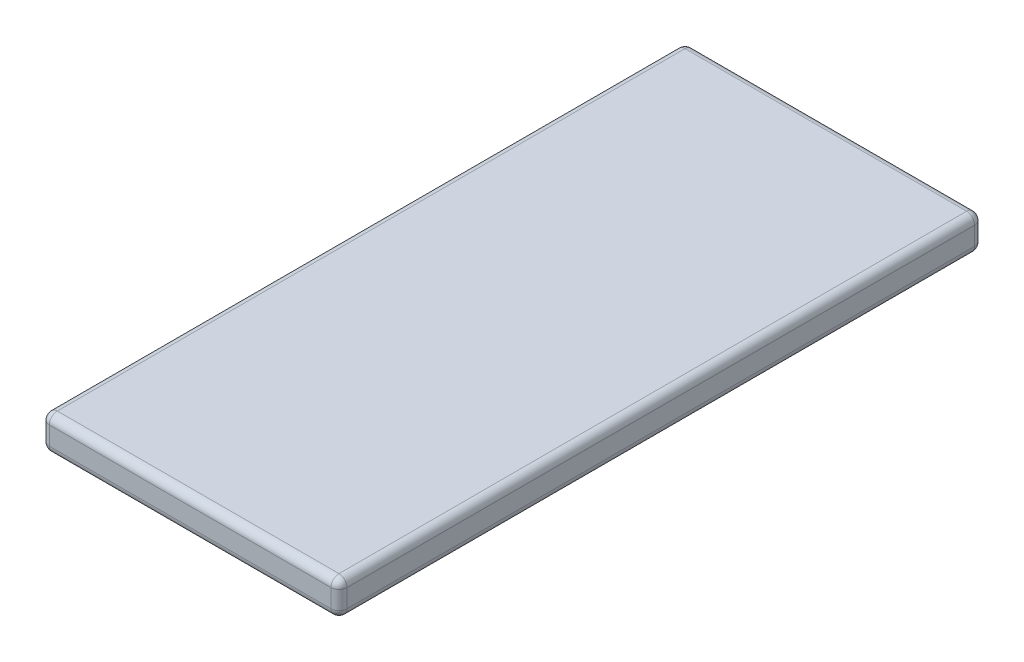
ISO-10303-21;
HEADER;
FILE_DESCRIPTION(('STEP AP214'),'2;1');
FILE_NAME('part.step','',(''),(''),'','','');
FILE_SCHEMA(('AUTOMOTIVE_DESIGN { 1 0 10303 214 1 1 1 1 }'));
ENDSEC;
DATA;
#1=APPLICATION_CONTEXT('core data for automotive mechanical design processes');
#2=APPLICATION_PROTOCOL_DEFINITION('international standard','automotive_design',2000,#1);
#3=PRODUCT_CONTEXT('',#1,'mechanical');
#4=PRODUCT('Part','Part','',(#3));
#5=PRODUCT_RELATED_PRODUCT_CATEGORY('part','',(#4));
#6=PRODUCT_DEFINITION_FORMATION('','',#4);
#7=PRODUCT_DEFINITION_CONTEXT('part definition',#1,'design');
#8=PRODUCT_DEFINITION('design','',#6,#7);
#9=PRODUCT_DEFINITION_SHAPE('','',#8);
#10=(LENGTH_UNIT() NAMED_UNIT(*) SI_UNIT(.MILLI.,.METRE.));
#11=(NAMED_UNIT(*) PLANE_ANGLE_UNIT() SI_UNIT($,.RADIAN.));
#12=(NAMED_UNIT(*) SI_UNIT($,.STERADIAN.) SOLID_ANGLE_UNIT());
#13=UNCERTAINTY_MEASURE_WITH_UNIT(LENGTH_MEASURE(1.E-05),#10,'distance_accuracy_value','');
#14=(GEOMETRIC_REPRESENTATION_CONTEXT(3) GLOBAL_UNCERTAINTY_ASSIGNED_CONTEXT((#13)) GLOBAL_UNIT_ASSIGNED_CONTEXT((#10,
#11,#12)) REPRESENTATION_CONTEXT('',''));
#15=CARTESIAN_POINT('',(0.,0.,0.));
#16=DIRECTION('',(0.,0.,1.));
#17=DIRECTION('',(1.,0.,0.));
#18=AXIS2_PLACEMENT_3D('',#15,#16,#17);
#19=CARTESIAN_POINT('',(37.,8.56,-80.));
#20=DIRECTION('',(-1.,0.,0.));
#21=DIRECTION('',(0.,0.,1.));
#22=AXIS2_PLACEMENT_3D('',#19,#20,#21);
#23=PLANE('',#22);
#24=DIRECTION('',(0.,0.,-1.));
#25=VECTOR('',#24,1.);
#26=CARTESIAN_POINT('',(37.,6.56,80.));
#27=LINE('',#26,#25);
#28=CARTESIAN_POINT('',(37.,6.56,-78.));
#29=VERTEX_POINT('',#28);
#30=CARTESIAN_POINT('',(37.,6.56,78.));
#31=VERTEX_POINT('',#30);
#32=EDGE_CURVE('E190',#29,#31,#27,.F.);
#33=ORIENTED_EDGE('',*,*,#32,.T.);
#34=DIRECTION('',(0.,-1.,0.));
#35=VECTOR('',#34,1.);
#36=CARTESIAN_POINT('',(37.,8.56,78.));
#37=LINE('',#36,#35);
#38=CARTESIAN_POINT('',(37.,2.,78.));
#39=VERTEX_POINT('',#38);
#40=EDGE_CURVE('E195',#31,#39,#37,.T.);
#41=ORIENTED_EDGE('',*,*,#40,.T.);
#42=DIRECTION('',(0.,0.,-1.));
#43=VECTOR('',#42,1.);
#44=CARTESIAN_POINT('',(37.,2.,-80.));
#45=LINE('',#44,#43);
#46=CARTESIAN_POINT('',(37.,2.,-78.));
#47=VERTEX_POINT('',#46);
#48=EDGE_CURVE('E192',#39,#47,#45,.T.);
#49=ORIENTED_EDGE('',*,*,#48,.T.);
#50=DIRECTION('',(0.,-1.,0.));
#51=VECTOR('',#50,1.);
#52=CARTESIAN_POINT('',(37.,8.56,-78.));
#53=LINE('',#52,#51);
#54=EDGE_CURVE('E188',#47,#29,#53,.F.);
#55=ORIENTED_EDGE('',*,*,#54,.T.);
#56=EDGE_LOOP('',(#33,#41,#49,#55));
#57=FACE_BOUND('',#56,.T.);
#58=ADVANCED_FACE('F36',(#57),#23,.F.);
#59=CARTESIAN_POINT('',(-37.,8.56,-80.));
#60=DIRECTION('',(0.,0.,1.));
#61=DIRECTION('',(1.,0.,0.));
#62=AXIS2_PLACEMENT_3D('',#59,#60,#61);
#63=PLANE('',#62);
#64=DIRECTION('',(-1.,0.,0.));
#65=VECTOR('',#64,1.);
#66=CARTESIAN_POINT('',(37.,6.56,-80.));
#67=LINE('',#66,#65);
#68=CARTESIAN_POINT('',(-35.,6.56,-80.));
#69=VERTEX_POINT('',#68);
#70=CARTESIAN_POINT('',(35.,6.56,-80.));
#71=VERTEX_POINT('',#70);
#72=EDGE_CURVE('E153',#69,#71,#67,.F.);
#73=ORIENTED_EDGE('',*,*,#72,.T.);
#74=DIRECTION('',(0.,-1.,0.));
#75=VECTOR('',#74,1.);
#76=CARTESIAN_POINT('',(35.,8.56,-80.));
#77=LINE('',#76,#75);
#78=CARTESIAN_POINT('',(35.,2.,-80.));
#79=VERTEX_POINT('',#78);
#80=EDGE_CURVE('E157',#71,#79,#77,.T.);
#81=ORIENTED_EDGE('',*,*,#80,.T.);
#82=DIRECTION('',(-1.,0.,0.));
#83=VECTOR('',#82,1.);
#84=CARTESIAN_POINT('',(-37.,2.,-80.));
#85=LINE('',#84,#83);
#86=CARTESIAN_POINT('',(-35.,2.,-80.));
#87=VERTEX_POINT('',#86);
#88=EDGE_CURVE('E129',#79,#87,#85,.T.);
#89=ORIENTED_EDGE('',*,*,#88,.T.);
#90=DIRECTION('',(0.,-1.,0.));
#91=VECTOR('',#90,1.);
#92=CARTESIAN_POINT('',(-35.,8.56,-80.));
#93=LINE('',#92,#91);
#94=EDGE_CURVE('E147',#87,#69,#93,.F.);
#95=ORIENTED_EDGE('',*,*,#94,.T.);
#96=EDGE_LOOP('',(#73,#81,#89,#95));
#97=FACE_BOUND('',#96,.T.);
#98=ADVANCED_FACE('F155',(#97),#63,.F.);
#99=CARTESIAN_POINT('',(-37.,8.56,-80.));
#100=DIRECTION('',(1.,0.,0.));
#101=DIRECTION('',(0.,0.,-1.));
#102=AXIS2_PLACEMENT_3D('',#99,#100,#101);
#103=PLANE('',#102);
#104=DIRECTION('',(0.,0.,1.));
#105=VECTOR('',#104,1.);
#106=CARTESIAN_POINT('',(-37.,2.,-80.));
#107=LINE('',#106,#105);
#108=CARTESIAN_POINT('',(-37.,2.,-78.));
#109=VERTEX_POINT('',#108);
#110=CARTESIAN_POINT('',(-37.,2.,78.));
#111=VERTEX_POINT('',#110);
#112=EDGE_CURVE('E174',#109,#111,#107,.T.);
#113=ORIENTED_EDGE('',*,*,#112,.T.);
#114=DIRECTION('',(0.,-1.,0.));
#115=VECTOR('',#114,1.);
#116=CARTESIAN_POINT('',(-37.,8.56,78.));
#117=LINE('',#116,#115);
#118=CARTESIAN_POINT('',(-37.,6.56,78.));
#119=VERTEX_POINT('',#118);
#120=EDGE_CURVE('E177',#111,#119,#117,.F.);
#121=ORIENTED_EDGE('',*,*,#120,.T.);
#122=DIRECTION('',(0.,0.,1.));
#123=VECTOR('',#122,1.);
#124=CARTESIAN_POINT('',(-37.,6.56,-80.));
#125=LINE('',#124,#123);
#126=CARTESIAN_POINT('',(-37.,6.56,-78.));
#127=VERTEX_POINT('',#126);
#128=EDGE_CURVE('E172',#119,#127,#125,.F.);
#129=ORIENTED_EDGE('',*,*,#128,.T.);
#130=DIRECTION('',(0.,-1.,0.));
#131=VECTOR('',#130,1.);
#132=CARTESIAN_POINT('',(-37.,8.56,-78.));
#133=LINE('',#132,#131);
#134=EDGE_CURVE('E170',#127,#109,#133,.T.);
#135=ORIENTED_EDGE('',*,*,#134,.T.);
#136=EDGE_LOOP('',(#113,#121,#129,#135));
#137=FACE_BOUND('',#136,.T.);
#138=ADVANCED_FACE('F330',(#137),#103,.F.);
#139=CARTESIAN_POINT('',(-37.,8.56,80.));
#140=DIRECTION('',(0.,0.,-1.));
#141=DIRECTION('',(-1.,0.,0.));
#142=AXIS2_PLACEMENT_3D('',#139,#140,#141);
#143=PLANE('',#142);
#144=DIRECTION('',(1.,0.,0.));
#145=VECTOR('',#144,1.);
#146=CARTESIAN_POINT('',(-37.,6.56,80.));
#147=LINE('',#146,#145);
#148=CARTESIAN_POINT('',(35.,6.56,80.));
#149=VERTEX_POINT('',#148);
#150=CARTESIAN_POINT('',(-35.,6.56,80.));
#151=VERTEX_POINT('',#150);
#152=EDGE_CURVE('E181',#149,#151,#147,.F.);
#153=ORIENTED_EDGE('',*,*,#152,.T.);
#154=DIRECTION('',(0.,-1.,0.));
#155=VECTOR('',#154,1.);
#156=CARTESIAN_POINT('',(-35.,8.56,80.));
#157=LINE('',#156,#155);
#158=CARTESIAN_POINT('',(-35.,2.,80.));
#159=VERTEX_POINT('',#158);
#160=EDGE_CURVE('E186',#151,#159,#157,.T.);
#161=ORIENTED_EDGE('',*,*,#160,.T.);
#162=DIRECTION('',(1.,0.,0.));
#163=VECTOR('',#162,1.);
#164=CARTESIAN_POINT('',(-37.,2.,80.));
#165=LINE('',#164,#163);
#166=CARTESIAN_POINT('',(35.,2.,80.));
#167=VERTEX_POINT('',#166);
#168=EDGE_CURVE('E183',#159,#167,#165,.T.);
#169=ORIENTED_EDGE('',*,*,#168,.T.);
#170=DIRECTION('',(0.,-1.,0.));
#171=VECTOR('',#170,1.);
#172=CARTESIAN_POINT('',(35.,8.56,80.));
#173=LINE('',#172,#171);
#174=EDGE_CURVE('E179',#167,#149,#173,.F.);
#175=ORIENTED_EDGE('',*,*,#174,.T.);
#176=EDGE_LOOP('',(#153,#161,#169,#175));
#177=FACE_BOUND('',#176,.T.);
#178=ADVANCED_FACE('F297',(#177),#143,.F.);
#179=CARTESIAN_POINT('',(0.,8.56,0.));
#180=DIRECTION('',(0.,1.,0.));
#181=DIRECTION('',(0.,0.,1.));
#182=AXIS2_PLACEMENT_3D('',#179,#180,#181);
#183=PLANE('',#182);
#184=DIRECTION('',(0.,0.,1.));
#185=VECTOR('',#184,1.);
#186=CARTESIAN_POINT('',(-35.,8.56,80.));
#187=LINE('',#186,#185);
#188=CARTESIAN_POINT('',(-35.,8.56,-78.));
#189=VERTEX_POINT('',#188);
#190=CARTESIAN_POINT('',(-35.,8.56,78.));
#191=VERTEX_POINT('',#190);
#192=EDGE_CURVE('E45',#189,#191,#187,.T.);
#193=ORIENTED_EDGE('',*,*,#192,.T.);
#194=DIRECTION('',(1.,0.,0.));
#195=VECTOR('',#194,1.);
#196=CARTESIAN_POINT('',(37.,8.56,78.));
#197=LINE('',#196,#195);
#198=CARTESIAN_POINT('',(35.,8.56,78.));
#199=VERTEX_POINT('',#198);
#200=EDGE_CURVE('E11',#191,#199,#197,.T.);
#201=ORIENTED_EDGE('',*,*,#200,.T.);
#202=DIRECTION('',(0.,0.,-1.));
#203=VECTOR('',#202,1.);
#204=CARTESIAN_POINT('',(35.,8.56,-80.));
#205=LINE('',#204,#203);
#206=CARTESIAN_POINT('',(35.,8.56,-78.));
#207=VERTEX_POINT('',#206);
#208=EDGE_CURVE('E197',#199,#207,#205,.T.);
#209=ORIENTED_EDGE('',*,*,#208,.T.);
#210=DIRECTION('',(-1.,0.,0.));
#211=VECTOR('',#210,1.);
#212=CARTESIAN_POINT('',(-37.,8.56,-78.));
#213=LINE('',#212,#211);
#214=EDGE_CURVE('E56',#207,#189,#213,.T.);
#215=ORIENTED_EDGE('',*,*,#214,.T.);
#216=EDGE_LOOP('',(#193,#201,#209,#215));
#217=FACE_BOUND('',#216,.T.);
#218=ADVANCED_FACE('F277',(#217),#183,.T.);
#219=CARTESIAN_POINT('',(0.,0.,0.));
#220=DIRECTION('',(0.,1.,0.));
#221=DIRECTION('',(0.,0.,1.));
#222=AXIS2_PLACEMENT_3D('',#219,#220,#221);
#223=PLANE('',#222);
#224=DIRECTION('',(0.,0.,1.));
#225=VECTOR('',#224,1.);
#226=CARTESIAN_POINT('',(-35.,0.,0.));
#227=LINE('',#226,#225);
#228=CARTESIAN_POINT('',(-35.,0.,78.));
#229=VERTEX_POINT('',#228);
#230=CARTESIAN_POINT('',(-35.,0.,-78.));
#231=VERTEX_POINT('',#230);
#232=EDGE_CURVE('E167',#229,#231,#227,.F.);
#233=ORIENTED_EDGE('',*,*,#232,.T.);
#234=DIRECTION('',(-1.,0.,0.));
#235=VECTOR('',#234,1.);
#236=CARTESIAN_POINT('',(0.,0.,-78.));
#237=LINE('',#236,#235);
#238=CARTESIAN_POINT('',(35.,0.,-78.));
#239=VERTEX_POINT('',#238);
#240=EDGE_CURVE('E131',#231,#239,#237,.F.);
#241=ORIENTED_EDGE('',*,*,#240,.T.);
#242=DIRECTION('',(0.,0.,-1.));
#243=VECTOR('',#242,1.);
#244=CARTESIAN_POINT('',(35.,0.,0.));
#245=LINE('',#244,#243);
#246=CARTESIAN_POINT('',(35.,0.,78.));
#247=VERTEX_POINT('',#246);
#248=EDGE_CURVE('E160',#239,#247,#245,.F.);
#249=ORIENTED_EDGE('',*,*,#248,.T.);
#250=DIRECTION('',(1.,0.,0.));
#251=VECTOR('',#250,1.);
#252=CARTESIAN_POINT('',(0.,0.,78.));
#253=LINE('',#252,#251);
#254=EDGE_CURVE('E165',#247,#229,#253,.F.);
#255=ORIENTED_EDGE('',*,*,#254,.T.);
#256=EDGE_LOOP('',(#233,#241,#249,#255));
#257=FACE_BOUND('',#256,.T.);
#258=ADVANCED_FACE('F358',(#257),#223,.F.);
#259=CARTESIAN_POINT('',(0.,6.56,78.));
#260=DIRECTION('',(-1.,0.,0.));
#261=DIRECTION('',(0.,0.,1.));
#262=AXIS2_PLACEMENT_3D('',#259,#260,#261);
#263=CYLINDRICAL_SURFACE('',#262,2.);
#264=CARTESIAN_POINT('',(35.,6.56,78.));
#265=DIRECTION('',(1.,0.,0.));
#266=DIRECTION('',(0.,0.,-1.));
#267=AXIS2_PLACEMENT_3D('',#264,#265,#266);
#268=CIRCLE('',#267,2.);
#269=EDGE_CURVE('E40',#199,#149,#268,.T.);
#270=ORIENTED_EDGE('',*,*,#269,.F.);
#271=ORIENTED_EDGE('',*,*,#200,.F.);
#272=CARTESIAN_POINT('',(-35.,6.56,78.));
#273=DIRECTION('',(-1.,0.,0.));
#274=DIRECTION('',(0.,0.,1.));
#275=AXIS2_PLACEMENT_3D('',#272,#273,#274);
#276=CIRCLE('',#275,2.);
#277=EDGE_CURVE('E250',#151,#191,#276,.T.);
#278=ORIENTED_EDGE('',*,*,#277,.F.);
#279=ORIENTED_EDGE('',*,*,#152,.F.);
#280=EDGE_LOOP('',(#270,#271,#278,#279));
#281=FACE_BOUND('',#280,.T.);
#282=ADVANCED_FACE('F38',(#281),#263,.T.);
#283=CARTESIAN_POINT('',(35.,6.56,78.));
#284=DIRECTION('',(0.,0.,1.));
#285=DIRECTION('',(1.,0.,0.));
#286=AXIS2_PLACEMENT_3D('',#283,#284,#285);
#287=SPHERICAL_SURFACE('',#286,2.);
#288=CARTESIAN_POINT('',(35.,6.56,78.));
#289=DIRECTION('',(0.,0.,1.));
#290=DIRECTION('',(1.,0.,0.));
#291=AXIS2_PLACEMENT_3D('',#288,#289,#290);
#292=CIRCLE('',#291,2.);
#293=EDGE_CURVE('E245',#199,#31,#292,.F.);
#294=ORIENTED_EDGE('',*,*,#293,.F.);
#295=ORIENTED_EDGE('',*,*,#269,.T.);
#296=CARTESIAN_POINT('',(35.,6.56,78.));
#297=DIRECTION('',(0.,1.,0.));
#298=DIRECTION('',(0.,0.,1.));
#299=AXIS2_PLACEMENT_3D('',#296,#297,#298);
#300=CIRCLE('',#299,2.);
#301=EDGE_CURVE('E248',#31,#149,#300,.F.);
#302=ORIENTED_EDGE('',*,*,#301,.F.);
#303=EDGE_LOOP('',(#294,#295,#302));
#304=FACE_BOUND('',#303,.T.);
#305=ADVANCED_FACE('F261',(#304),#287,.T.);
#306=CARTESIAN_POINT('',(-35.,6.56,78.));
#307=DIRECTION('',(0.,1.,0.));
#308=DIRECTION('',(0.,0.,1.));
#309=AXIS2_PLACEMENT_3D('',#306,#307,#308);
#310=SPHERICAL_SURFACE('',#309,2.);
#311=CARTESIAN_POINT('',(-35.,6.56,78.));
#312=DIRECTION('',(0.,1.,0.));
#313=DIRECTION('',(0.,0.,1.));
#314=AXIS2_PLACEMENT_3D('',#311,#312,#313);
#315=CIRCLE('',#314,2.);
#316=EDGE_CURVE('E239',#151,#119,#315,.F.);
#317=ORIENTED_EDGE('',*,*,#316,.F.);
#318=ORIENTED_EDGE('',*,*,#277,.T.);
#319=CARTESIAN_POINT('',(-35.,6.56,78.));
#320=DIRECTION('',(0.,0.,1.));
#321=DIRECTION('',(1.,0.,0.));
#322=AXIS2_PLACEMENT_3D('',#319,#320,#321);
#323=CIRCLE('',#322,2.);
#324=EDGE_CURVE('E242',#119,#191,#323,.F.);
#325=ORIENTED_EDGE('',*,*,#324,.F.);
#326=EDGE_LOOP('',(#317,#318,#325));
#327=FACE_BOUND('',#326,.T.);
#328=ADVANCED_FACE('F289',(#327),#310,.T.);
#329=CARTESIAN_POINT('',(35.,8.56,78.));
#330=DIRECTION('',(0.,-1.,0.));
#331=DIRECTION('',(0.,0.,-1.));
#332=AXIS2_PLACEMENT_3D('',#329,#330,#331);
#333=CYLINDRICAL_SURFACE('',#332,2.);
#334=ORIENTED_EDGE('',*,*,#301,.T.);
#335=ORIENTED_EDGE('',*,*,#174,.F.);
#336=CARTESIAN_POINT('',(35.,2.,78.));
#337=DIRECTION('',(0.,-1.,0.));
#338=DIRECTION('',(0.,0.,-1.));
#339=AXIS2_PLACEMENT_3D('',#336,#337,#338);
#340=CIRCLE('',#339,2.);
#341=EDGE_CURVE('E234',#39,#167,#340,.T.);
#342=ORIENTED_EDGE('',*,*,#341,.F.);
#343=ORIENTED_EDGE('',*,*,#40,.F.);
#344=EDGE_LOOP('',(#334,#335,#342,#343));
#345=FACE_BOUND('',#344,.T.);
#346=ADVANCED_FACE('F267',(#345),#333,.T.);
#347=CARTESIAN_POINT('',(35.,6.56,0.));
#348=DIRECTION('',(0.,0.,1.));
#349=DIRECTION('',(1.,0.,0.));
#350=AXIS2_PLACEMENT_3D('',#347,#348,#349);
#351=CYLINDRICAL_SURFACE('',#350,2.);
#352=ORIENTED_EDGE('',*,*,#293,.T.);
#353=ORIENTED_EDGE('',*,*,#32,.F.);
#354=CARTESIAN_POINT('',(35.,6.56,-78.));
#355=DIRECTION('',(0.,0.,-1.));
#356=DIRECTION('',(-1.,0.,0.));
#357=AXIS2_PLACEMENT_3D('',#354,#355,#356);
#358=CIRCLE('',#357,2.);
#359=EDGE_CURVE('E231',#207,#29,#358,.T.);
#360=ORIENTED_EDGE('',*,*,#359,.F.);
#361=ORIENTED_EDGE('',*,*,#208,.F.);
#362=EDGE_LOOP('',(#352,#353,#360,#361));
#363=FACE_BOUND('',#362,.T.);
#364=ADVANCED_FACE('F276',(#363),#351,.T.);
#365=CARTESIAN_POINT('',(0.,6.56,-78.));
#366=DIRECTION('',(1.,0.,0.));
#367=DIRECTION('',(0.,0.,-1.));
#368=AXIS2_PLACEMENT_3D('',#365,#366,#367);
#369=CYLINDRICAL_SURFACE('',#368,2.);
#370=CARTESIAN_POINT('',(-35.,6.56,-78.));
#371=DIRECTION('',(-1.,0.,0.));
#372=DIRECTION('',(0.,0.,1.));
#373=AXIS2_PLACEMENT_3D('',#370,#371,#372);
#374=CIRCLE('',#373,2.);
#375=EDGE_CURVE('E225',#189,#69,#374,.T.);
#376=ORIENTED_EDGE('',*,*,#375,.F.);
#377=ORIENTED_EDGE('',*,*,#214,.F.);
#378=CARTESIAN_POINT('',(35.,6.56,-78.));
#379=DIRECTION('',(1.,0.,0.));
#380=DIRECTION('',(0.,0.,-1.));
#381=AXIS2_PLACEMENT_3D('',#378,#379,#380);
#382=CIRCLE('',#381,2.);
#383=EDGE_CURVE('E228',#71,#207,#382,.T.);
#384=ORIENTED_EDGE('',*,*,#383,.F.);
#385=ORIENTED_EDGE('',*,*,#72,.F.);
#386=EDGE_LOOP('',(#376,#377,#384,#385));
#387=FACE_BOUND('',#386,.T.);
#388=ADVANCED_FACE('F281',(#387),#369,.T.);
#389=CARTESIAN_POINT('',(-35.,6.56,0.));
#390=DIRECTION('',(0.,0.,-1.));
#391=DIRECTION('',(-1.,0.,0.));
#392=AXIS2_PLACEMENT_3D('',#389,#390,#391);
#393=CYLINDRICAL_SURFACE('',#392,2.);
#394=ORIENTED_EDGE('',*,*,#324,.T.);
#395=ORIENTED_EDGE('',*,*,#192,.F.);
#396=CARTESIAN_POINT('',(-35.,6.56,-78.));
#397=DIRECTION('',(0.,0.,-1.));
#398=DIRECTION('',(-1.,0.,0.));
#399=AXIS2_PLACEMENT_3D('',#396,#397,#398);
#400=CIRCLE('',#399,2.);
#401=EDGE_CURVE('E222',#127,#189,#400,.T.);
#402=ORIENTED_EDGE('',*,*,#401,.F.);
#403=ORIENTED_EDGE('',*,*,#128,.F.);
#404=EDGE_LOOP('',(#394,#395,#402,#403));
#405=FACE_BOUND('',#404,.T.);
#406=ADVANCED_FACE('F288',(#405),#393,.T.);
#407=CARTESIAN_POINT('',(-35.,8.56,78.));
#408=DIRECTION('',(0.,-1.,0.));
#409=DIRECTION('',(0.,0.,-1.));
#410=AXIS2_PLACEMENT_3D('',#407,#408,#409);
#411=CYLINDRICAL_SURFACE('',#410,2.);
#412=ORIENTED_EDGE('',*,*,#316,.T.);
#413=ORIENTED_EDGE('',*,*,#120,.F.);
#414=CARTESIAN_POINT('',(-35.,2.,78.));
#415=DIRECTION('',(0.,-1.,0.));
#416=DIRECTION('',(0.,0.,-1.));
#417=AXIS2_PLACEMENT_3D('',#414,#415,#416);
#418=CIRCLE('',#417,2.);
#419=EDGE_CURVE('E219',#159,#111,#418,.T.);
#420=ORIENTED_EDGE('',*,*,#419,.F.);
#421=ORIENTED_EDGE('',*,*,#160,.F.);
#422=EDGE_LOOP('',(#412,#413,#420,#421));
#423=FACE_BOUND('',#422,.T.);
#424=ADVANCED_FACE('F294',(#423),#411,.T.);
#425=CARTESIAN_POINT('',(-37.,2.,78.));
#426=DIRECTION('',(1.,0.,0.));
#427=DIRECTION('',(0.,0.,-1.));
#428=AXIS2_PLACEMENT_3D('',#425,#426,#427);
#429=CYLINDRICAL_SURFACE('',#428,2.);
#430=CARTESIAN_POINT('',(35.,2.,78.));
#431=DIRECTION('',(1.,0.,0.));
#432=DIRECTION('',(0.,0.,-1.));
#433=AXIS2_PLACEMENT_3D('',#430,#431,#432);
#434=CIRCLE('',#433,2.);
#435=EDGE_CURVE('E236',#167,#247,#434,.T.);
#436=ORIENTED_EDGE('',*,*,#435,.F.);
#437=ORIENTED_EDGE('',*,*,#168,.F.);
#438=CARTESIAN_POINT('',(-35.,2.,78.));
#439=DIRECTION('',(-1.,0.,0.));
#440=DIRECTION('',(0.,0.,1.));
#441=AXIS2_PLACEMENT_3D('',#438,#439,#440);
#442=CIRCLE('',#441,2.);
#443=EDGE_CURVE('E216',#229,#159,#442,.T.);
#444=ORIENTED_EDGE('',*,*,#443,.F.);
#445=ORIENTED_EDGE('',*,*,#254,.F.);
#446=EDGE_LOOP('',(#436,#437,#444,#445));
#447=FACE_BOUND('',#446,.T.);
#448=ADVANCED_FACE('F301',(#447),#429,.T.);
#449=CARTESIAN_POINT('',(35.,2.,78.));
#450=DIRECTION('',(0.,0.,1.));
#451=DIRECTION('',(1.,0.,0.));
#452=AXIS2_PLACEMENT_3D('',#449,#450,#451);
#453=SPHERICAL_SURFACE('',#452,2.);
#454=ORIENTED_EDGE('',*,*,#341,.T.);
#455=ORIENTED_EDGE('',*,*,#435,.T.);
#456=CARTESIAN_POINT('',(35.,2.,78.));
#457=DIRECTION('',(0.,0.,1.));
#458=DIRECTION('',(1.,0.,0.));
#459=AXIS2_PLACEMENT_3D('',#456,#457,#458);
#460=CIRCLE('',#459,2.);
#461=EDGE_CURVE('E213',#39,#247,#460,.F.);
#462=ORIENTED_EDGE('',*,*,#461,.F.);
#463=EDGE_LOOP('',(#454,#455,#462));
#464=FACE_BOUND('',#463,.T.);
#465=ADVANCED_FACE('F305',(#464),#453,.T.);
#466=CARTESIAN_POINT('',(35.,6.56,-78.));
#467=DIRECTION('',(0.,1.,0.));
#468=DIRECTION('',(0.,0.,1.));
#469=AXIS2_PLACEMENT_3D('',#466,#467,#468);
#470=SPHERICAL_SURFACE('',#469,2.);
#471=ORIENTED_EDGE('',*,*,#383,.T.);
#472=ORIENTED_EDGE('',*,*,#359,.T.);
#473=CARTESIAN_POINT('',(35.,6.56,-78.));
#474=DIRECTION('',(0.,1.,0.));
#475=DIRECTION('',(0.,0.,1.));
#476=AXIS2_PLACEMENT_3D('',#473,#474,#475);
#477=CIRCLE('',#476,2.);
#478=EDGE_CURVE('E210',#71,#29,#477,.F.);
#479=ORIENTED_EDGE('',*,*,#478,.F.);
#480=EDGE_LOOP('',(#471,#472,#479));
#481=FACE_BOUND('',#480,.T.);
#482=ADVANCED_FACE('F315',(#481),#470,.T.);
#483=CARTESIAN_POINT('',(-35.,6.56,-78.));
#484=DIRECTION('',(0.,1.,0.));
#485=DIRECTION('',(0.,0.,1.));
#486=AXIS2_PLACEMENT_3D('',#483,#484,#485);
#487=SPHERICAL_SURFACE('',#486,2.);
#488=ORIENTED_EDGE('',*,*,#401,.T.);
#489=ORIENTED_EDGE('',*,*,#375,.T.);
#490=CARTESIAN_POINT('',(-35.,6.56,-78.));
#491=DIRECTION('',(0.,1.,0.));
#492=DIRECTION('',(0.,0.,1.));
#493=AXIS2_PLACEMENT_3D('',#490,#491,#492);
#494=CIRCLE('',#493,2.);
#495=EDGE_CURVE('E150',#127,#69,#494,.F.);
#496=ORIENTED_EDGE('',*,*,#495,.F.);
#497=EDGE_LOOP('',(#488,#489,#496));
#498=FACE_BOUND('',#497,.T.);
#499=ADVANCED_FACE('F285',(#498),#487,.T.);
#500=CARTESIAN_POINT('',(-35.,2.,78.));
#501=DIRECTION('',(0.,0.,1.));
#502=DIRECTION('',(1.,0.,0.));
#503=AXIS2_PLACEMENT_3D('',#500,#501,#502);
#504=SPHERICAL_SURFACE('',#503,2.);
#505=ORIENTED_EDGE('',*,*,#443,.T.);
#506=ORIENTED_EDGE('',*,*,#419,.T.);
#507=CARTESIAN_POINT('',(-35.,2.,78.));
#508=DIRECTION('',(0.,0.,1.));
#509=DIRECTION('',(1.,0.,0.));
#510=AXIS2_PLACEMENT_3D('',#507,#508,#509);
#511=CIRCLE('',#510,2.);
#512=EDGE_CURVE('E207',#229,#111,#511,.F.);
#513=ORIENTED_EDGE('',*,*,#512,.F.);
#514=EDGE_LOOP('',(#505,#506,#513));
#515=FACE_BOUND('',#514,.T.);
#516=ADVANCED_FACE('F322',(#515),#504,.T.);
#517=CARTESIAN_POINT('',(35.,2.,-80.));
#518=DIRECTION('',(0.,0.,-1.));
#519=DIRECTION('',(-1.,0.,0.));
#520=AXIS2_PLACEMENT_3D('',#517,#518,#519);
#521=CYLINDRICAL_SURFACE('',#520,2.);
#522=ORIENTED_EDGE('',*,*,#461,.T.);
#523=ORIENTED_EDGE('',*,*,#248,.F.);
#524=CARTESIAN_POINT('',(35.,2.,-78.));
#525=DIRECTION('',(0.,0.,-1.));
#526=DIRECTION('',(-1.,0.,0.));
#527=AXIS2_PLACEMENT_3D('',#524,#525,#526);
#528=CIRCLE('',#527,2.);
#529=EDGE_CURVE('E204',#47,#239,#528,.T.);
#530=ORIENTED_EDGE('',*,*,#529,.F.);
#531=ORIENTED_EDGE('',*,*,#48,.F.);
#532=EDGE_LOOP('',(#522,#523,#530,#531));
#533=FACE_BOUND('',#532,.T.);
#534=ADVANCED_FACE('F308',(#533),#521,.T.);
#535=CARTESIAN_POINT('',(35.,8.56,-78.));
#536=DIRECTION('',(0.,-1.,0.));
#537=DIRECTION('',(0.,0.,-1.));
#538=AXIS2_PLACEMENT_3D('',#535,#536,#537);
#539=CYLINDRICAL_SURFACE('',#538,2.);
#540=ORIENTED_EDGE('',*,*,#478,.T.);
#541=ORIENTED_EDGE('',*,*,#54,.F.);
#542=CARTESIAN_POINT('',(35.,2.,-78.));
#543=DIRECTION('',(0.,-1.,0.));
#544=DIRECTION('',(0.,0.,-1.));
#545=AXIS2_PLACEMENT_3D('',#542,#543,#544);
#546=CIRCLE('',#545,2.);
#547=EDGE_CURVE('E144',#79,#47,#546,.T.);
#548=ORIENTED_EDGE('',*,*,#547,.F.);
#549=ORIENTED_EDGE('',*,*,#80,.F.);
#550=EDGE_LOOP('',(#540,#541,#548,#549));
#551=FACE_BOUND('',#550,.T.);
#552=ADVANCED_FACE('F313',(#551),#539,.T.);
#553=CARTESIAN_POINT('',(-35.,8.56,-78.));
#554=DIRECTION('',(0.,-1.,0.));
#555=DIRECTION('',(0.,0.,-1.));
#556=AXIS2_PLACEMENT_3D('',#553,#554,#555);
#557=CYLINDRICAL_SURFACE('',#556,2.);
#558=ORIENTED_EDGE('',*,*,#495,.T.);
#559=ORIENTED_EDGE('',*,*,#94,.F.);
#560=CARTESIAN_POINT('',(-35.,2.,-78.));
#561=DIRECTION('',(0.,-1.,0.));
#562=DIRECTION('',(0.,0.,-1.));
#563=AXIS2_PLACEMENT_3D('',#560,#561,#562);
#564=CIRCLE('',#563,2.);
#565=EDGE_CURVE('E137',#109,#87,#564,.T.);
#566=ORIENTED_EDGE('',*,*,#565,.F.);
#567=ORIENTED_EDGE('',*,*,#134,.F.);
#568=EDGE_LOOP('',(#558,#559,#566,#567));
#569=FACE_BOUND('',#568,.T.);
#570=ADVANCED_FACE('F148',(#569),#557,.T.);
#571=CARTESIAN_POINT('',(-35.,2.,-80.));
#572=DIRECTION('',(0.,0.,1.));
#573=DIRECTION('',(1.,0.,0.));
#574=AXIS2_PLACEMENT_3D('',#571,#572,#573);
#575=CYLINDRICAL_SURFACE('',#574,2.);
#576=ORIENTED_EDGE('',*,*,#512,.T.);
#577=ORIENTED_EDGE('',*,*,#112,.F.);
#578=CARTESIAN_POINT('',(-35.,2.,-78.));
#579=DIRECTION('',(0.,0.,-1.));
#580=DIRECTION('',(-1.,0.,0.));
#581=AXIS2_PLACEMENT_3D('',#578,#579,#580);
#582=CIRCLE('',#581,2.);
#583=EDGE_CURVE('E141',#231,#109,#582,.T.);
#584=ORIENTED_EDGE('',*,*,#583,.F.);
#585=ORIENTED_EDGE('',*,*,#232,.F.);
#586=EDGE_LOOP('',(#576,#577,#584,#585));
#587=FACE_BOUND('',#586,.T.);
#588=ADVANCED_FACE('F341',(#587),#575,.T.);
#589=CARTESIAN_POINT('',(35.,2.,-78.));
#590=DIRECTION('',(1.,0.,0.));
#591=DIRECTION('',(0.,0.,-1.));
#592=AXIS2_PLACEMENT_3D('',#589,#590,#591);
#593=SPHERICAL_SURFACE('',#592,2.);
#594=ORIENTED_EDGE('',*,*,#547,.T.);
#595=ORIENTED_EDGE('',*,*,#529,.T.);
#596=CARTESIAN_POINT('',(35.,2.,-78.));
#597=DIRECTION('',(1.,0.,0.));
#598=DIRECTION('',(0.,0.,-1.));
#599=AXIS2_PLACEMENT_3D('',#596,#597,#598);
#600=CIRCLE('',#599,2.);
#601=EDGE_CURVE('E134',#79,#239,#600,.F.);
#602=ORIENTED_EDGE('',*,*,#601,.F.);
#603=EDGE_LOOP('',(#594,#595,#602));
#604=FACE_BOUND('',#603,.T.);
#605=ADVANCED_FACE('F338',(#604),#593,.T.);
#606=CARTESIAN_POINT('',(-35.,2.,-78.));
#607=DIRECTION('',(-1.,0.,0.));
#608=DIRECTION('',(0.,0.,1.));
#609=AXIS2_PLACEMENT_3D('',#606,#607,#608);
#610=SPHERICAL_SURFACE('',#609,2.);
#611=ORIENTED_EDGE('',*,*,#583,.T.);
#612=ORIENTED_EDGE('',*,*,#565,.T.);
#613=CARTESIAN_POINT('',(-35.,2.,-78.));
#614=DIRECTION('',(-1.,0.,0.));
#615=DIRECTION('',(0.,0.,1.));
#616=AXIS2_PLACEMENT_3D('',#613,#614,#615);
#617=CIRCLE('',#616,2.);
#618=EDGE_CURVE('E125',#231,#87,#617,.F.);
#619=ORIENTED_EDGE('',*,*,#618,.F.);
#620=EDGE_LOOP('',(#611,#612,#619));
#621=FACE_BOUND('',#620,.T.);
#622=ADVANCED_FACE('F139',(#621),#610,.T.);
#623=CARTESIAN_POINT('',(-37.,2.,-78.));
#624=DIRECTION('',(-1.,0.,0.));
#625=DIRECTION('',(0.,0.,1.));
#626=AXIS2_PLACEMENT_3D('',#623,#624,#625);
#627=CYLINDRICAL_SURFACE('',#626,2.);
#628=ORIENTED_EDGE('',*,*,#601,.T.);
#629=ORIENTED_EDGE('',*,*,#240,.F.);
#630=ORIENTED_EDGE('',*,*,#618,.T.);
#631=ORIENTED_EDGE('',*,*,#88,.F.);
#632=EDGE_LOOP('',(#628,#629,#630,#631));
#633=FACE_BOUND('',#632,.T.);
#634=ADVANCED_FACE('F127',(#633),#627,.T.);
#635=CLOSED_SHELL('',(#58,#98,#138,#178,#218,#258,#282,#305,#328,#346,#364,#388,#406,#424,#448,
#465,#482,#499,#516,#534,#552,#570,#588,#605,#622,#634));
#636=MANIFOLD_SOLID_BREP('B2',#635);
#637=ADVANCED_BREP_SHAPE_REPRESENTATION('',(#18,#636),#14);
#638=SHAPE_DEFINITION_REPRESENTATION(#9,#637);
ENDSEC;
END-ISO-10303-21;
